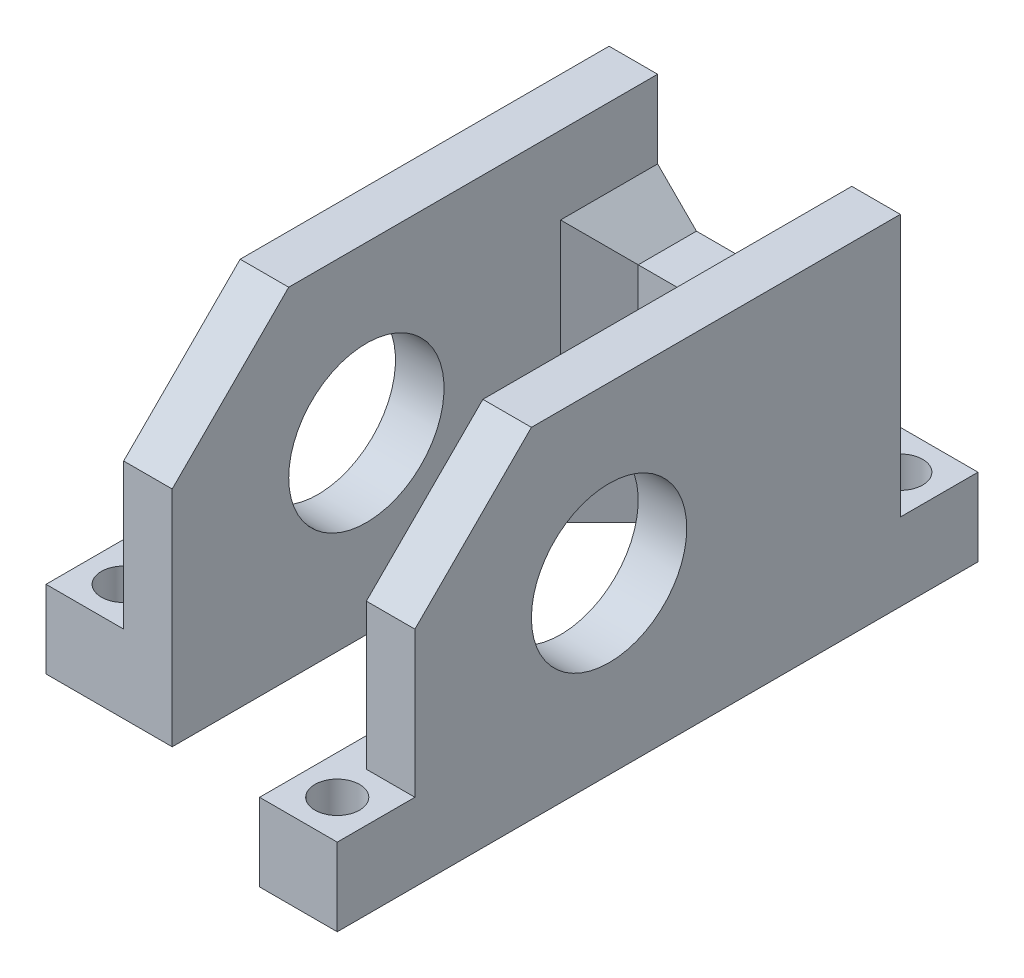
ISO-10303-21;
HEADER;
FILE_DESCRIPTION(('STEP AP214'),'2;1');
FILE_NAME('part.step','',(''),(''),'','','');
FILE_SCHEMA(('AUTOMOTIVE_DESIGN { 1 0 10303 214 1 1 1 1 }'));
ENDSEC;
DATA;
#1=APPLICATION_CONTEXT('core data for automotive mechanical design processes');
#2=APPLICATION_PROTOCOL_DEFINITION('international standard','automotive_design',2000,#1);
#3=PRODUCT_CONTEXT('',#1,'mechanical');
#4=PRODUCT('Part','Part','',(#3));
#5=PRODUCT_RELATED_PRODUCT_CATEGORY('part','',(#4));
#6=PRODUCT_DEFINITION_FORMATION('','',#4);
#7=PRODUCT_DEFINITION_CONTEXT('part definition',#1,'design');
#8=PRODUCT_DEFINITION('design','',#6,#7);
#9=PRODUCT_DEFINITION_SHAPE('','',#8);
#10=(LENGTH_UNIT() NAMED_UNIT(*) SI_UNIT(.MILLI.,.METRE.));
#11=(NAMED_UNIT(*) PLANE_ANGLE_UNIT() SI_UNIT($,.RADIAN.));
#12=(NAMED_UNIT(*) SI_UNIT($,.STERADIAN.) SOLID_ANGLE_UNIT());
#13=UNCERTAINTY_MEASURE_WITH_UNIT(LENGTH_MEASURE(1.E-05),#10,'distance_accuracy_value','');
#14=(GEOMETRIC_REPRESENTATION_CONTEXT(3) GLOBAL_UNCERTAINTY_ASSIGNED_CONTEXT((#13)) GLOBAL_UNIT_ASSIGNED_CONTEXT((#10,
#11,#12)) REPRESENTATION_CONTEXT('',''));
#15=CARTESIAN_POINT('',(0.,0.,0.));
#16=DIRECTION('',(0.,0.,1.));
#17=DIRECTION('',(1.,0.,0.));
#18=AXIS2_PLACEMENT_3D('',#15,#16,#17);
#19=CARTESIAN_POINT('',(0.,35.,-9.));
#20=DIRECTION('',(0.,0.,-1.));
#21=DIRECTION('',(-1.,0.,0.));
#22=AXIS2_PLACEMENT_3D('',#19,#20,#21);
#23=PLANE('',#22);
#24=DIRECTION('',(-0.707106781186548,-0.707106781186548,0.));
#25=VECTOR('',#24,1.);
#26=CARTESIAN_POINT('',(-12.5,12.5,-9.));
#27=LINE('',#26,#25);
#28=CARTESIAN_POINT('',(2.,27.,-9.));
#29=VERTEX_POINT('',#28);
#30=CARTESIAN_POINT('',(-2.,23.,-9.));
#31=VERTEX_POINT('',#30);
#32=EDGE_CURVE('E521',#29,#31,#27,.T.);
#33=ORIENTED_EDGE('',*,*,#32,.F.);
#34=DIRECTION('',(0.,1.,0.));
#35=VECTOR('',#34,1.);
#36=CARTESIAN_POINT('',(2.,0.,-9.));
#37=LINE('',#36,#35);
#38=CARTESIAN_POINT('',(2.,35.,-9.));
#39=VERTEX_POINT('',#38);
#40=EDGE_CURVE('E518',#29,#39,#37,.T.);
#41=ORIENTED_EDGE('',*,*,#40,.T.);
#42=DIRECTION('',(1.,0.,0.));
#43=VECTOR('',#42,1.);
#44=CARTESIAN_POINT('',(0.,35.,-9.));
#45=LINE('',#44,#43);
#46=CARTESIAN_POINT('',(7.,35.,-9.));
#47=VERTEX_POINT('',#46);
#48=EDGE_CURVE('E255',#39,#47,#45,.T.);
#49=ORIENTED_EDGE('',*,*,#48,.T.);
#50=DIRECTION('',(0.,-1.,0.));
#51=VECTOR('',#50,1.);
#52=CARTESIAN_POINT('',(7.,35.,-9.));
#53=LINE('',#52,#51);
#54=CARTESIAN_POINT('',(7.,8.,-9.));
#55=VERTEX_POINT('',#54);
#56=EDGE_CURVE('E263',#47,#55,#53,.T.);
#57=ORIENTED_EDGE('',*,*,#56,.T.);
#58=DIRECTION('',(1.,0.,0.));
#59=VECTOR('',#58,1.);
#60=CARTESIAN_POINT('',(0.,8.,-9.));
#61=LINE('',#60,#59);
#62=CARTESIAN_POINT('',(-1.00000000000001,8.,-9.));
#63=VERTEX_POINT('',#62);
#64=EDGE_CURVE('E435',#63,#55,#61,.T.);
#65=ORIENTED_EDGE('',*,*,#64,.F.);
#66=DIRECTION('',(0.,-1.,0.));
#67=VECTOR('',#66,1.);
#68=CARTESIAN_POINT('',(-1.00000000000001,8.,-9.));
#69=LINE('',#68,#67);
#70=CARTESIAN_POINT('',(-1.00000000000001,0.,-9.));
#71=VERTEX_POINT('',#70);
#72=EDGE_CURVE('E448',#63,#71,#69,.T.);
#73=ORIENTED_EDGE('',*,*,#72,.T.);
#74=DIRECTION('',(1.,0.,0.));
#75=VECTOR('',#74,1.);
#76=CARTESIAN_POINT('',(0.,0.,-9.));
#77=LINE('',#76,#75);
#78=CARTESIAN_POINT('',(-31.,0.,-8.99999999999999));
#79=VERTEX_POINT('',#78);
#80=EDGE_CURVE('E264',#79,#71,#77,.T.);
#81=ORIENTED_EDGE('',*,*,#80,.F.);
#82=DIRECTION('',(0.,-1.,0.));
#83=VECTOR('',#82,1.);
#84=CARTESIAN_POINT('',(-31.,8.,-8.99999999999999));
#85=LINE('',#84,#83);
#86=CARTESIAN_POINT('',(-31.,8.,-8.99999999999999));
#87=VERTEX_POINT('',#86);
#88=EDGE_CURVE('E338',#87,#79,#85,.T.);
#89=ORIENTED_EDGE('',*,*,#88,.F.);
#90=DIRECTION('',(-1.,0.,0.));
#91=VECTOR('',#90,1.);
#92=CARTESIAN_POINT('',(0.,8.,-9.00000000000002));
#93=LINE('',#92,#91);
#94=CARTESIAN_POINT('',(-23.,8.,-9.));
#95=VERTEX_POINT('',#94);
#96=EDGE_CURVE('E336',#95,#87,#93,.T.);
#97=ORIENTED_EDGE('',*,*,#96,.F.);
#98=DIRECTION('',(0.,-1.,0.));
#99=VECTOR('',#98,1.);
#100=CARTESIAN_POINT('',(-23.,35.,-9.));
#101=LINE('',#100,#99);
#102=CARTESIAN_POINT('',(-23.,35.,-9.));
#103=VERTEX_POINT('',#102);
#104=EDGE_CURVE('E293',#103,#95,#101,.T.);
#105=ORIENTED_EDGE('',*,*,#104,.F.);
#106=CARTESIAN_POINT('',(-18.,35.,-9.));
#107=VERTEX_POINT('',#106);
#108=EDGE_CURVE('E250',#103,#107,#45,.T.);
#109=ORIENTED_EDGE('',*,*,#108,.T.);
#110=DIRECTION('',(0.,1.,0.));
#111=VECTOR('',#110,1.);
#112=CARTESIAN_POINT('',(-18.,0.,-9.));
#113=LINE('',#112,#111);
#114=CARTESIAN_POINT('',(-18.,27.,-9.));
#115=VERTEX_POINT('',#114);
#116=EDGE_CURVE('E515',#115,#107,#113,.T.);
#117=ORIENTED_EDGE('',*,*,#116,.F.);
#118=DIRECTION('',(0.707106781186548,-0.707106781186548,0.));
#119=VECTOR('',#118,1.);
#120=CARTESIAN_POINT('',(4.5,4.5,-9.));
#121=LINE('',#120,#119);
#122=CARTESIAN_POINT('',(-14.,23.,-9.));
#123=VERTEX_POINT('',#122);
#124=EDGE_CURVE('E512',#115,#123,#121,.T.);
#125=ORIENTED_EDGE('',*,*,#124,.T.);
#126=DIRECTION('',(-1.,0.,0.));
#127=VECTOR('',#126,1.);
#128=CARTESIAN_POINT('',(0.,23.,-9.));
#129=LINE('',#128,#127);
#130=EDGE_CURVE('E524',#31,#123,#129,.T.);
#131=ORIENTED_EDGE('',*,*,#130,.F.);
#132=EDGE_LOOP('',(#33,#41,#49,#57,#65,#73,#81,#89,#97,#105,#109,#117,#125,#131));
#133=FACE_BOUND('',#132,.T.);
#134=ADVANCED_FACE('F50',(#133),#23,.T.);
#135=CARTESIAN_POINT('',(0.,35.,0.));
#136=DIRECTION('',(0.,1.,0.));
#137=DIRECTION('',(0.,0.,1.));
#138=AXIS2_PLACEMENT_3D('',#135,#136,#137);
#139=PLANE('',#138);
#140=DIRECTION('',(-1.,0.,0.));
#141=VECTOR('',#140,1.);
#142=CARTESIAN_POINT('',(27.,35.,29.));
#143=LINE('',#142,#141);
#144=CARTESIAN_POINT('',(7.,35.,29.));
#145=VERTEX_POINT('',#144);
#146=CARTESIAN_POINT('',(2.00000000000001,35.,29.));
#147=VERTEX_POINT('',#146);
#148=EDGE_CURVE('E246',#145,#147,#143,.T.);
#149=ORIENTED_EDGE('',*,*,#148,.F.);
#150=DIRECTION('',(0.,0.,1.));
#151=VECTOR('',#150,1.);
#152=CARTESIAN_POINT('',(7.,35.,0.));
#153=LINE('',#152,#151);
#154=EDGE_CURVE('E260',#47,#145,#153,.T.);
#155=ORIENTED_EDGE('',*,*,#154,.F.);
#156=ORIENTED_EDGE('',*,*,#48,.F.);
#157=DIRECTION('',(0.,0.,-1.));
#158=VECTOR('',#157,1.);
#159=CARTESIAN_POINT('',(2.00000000000001,35.,0.));
#160=LINE('',#159,#158);
#161=EDGE_CURVE('E253',#147,#39,#160,.T.);
#162=ORIENTED_EDGE('',*,*,#161,.F.);
#163=EDGE_LOOP('',(#149,#155,#156,#162));
#164=FACE_BOUND('',#163,.T.);
#165=ADVANCED_FACE('F569',(#164),#139,.T.);
#166=CARTESIAN_POINT('',(-18.,35.,1.));
#167=DIRECTION('',(0.707106781186547,0.,0.707106781186548));
#168=DIRECTION('',(0.707106781186548,0.,-0.707106781186547));
#169=AXIS2_PLACEMENT_3D('',#166,#167,#168);
#170=PLANE('',#169);
#171=DIRECTION('',(0.,-1.,0.));
#172=VECTOR('',#171,1.);
#173=CARTESIAN_POINT('',(-14.,35.,-3.));
#174=LINE('',#173,#172);
#175=CARTESIAN_POINT('',(-14.,23.,-2.99999999999999));
#176=VERTEX_POINT('',#175);
#177=CARTESIAN_POINT('',(-14.,0.,-3.));
#178=VERTEX_POINT('',#177);
#179=EDGE_CURVE('E306',#176,#178,#174,.T.);
#180=ORIENTED_EDGE('',*,*,#179,.F.);
#181=DIRECTION('',(-0.577350269189626,0.577350269189626,0.577350269189625));
#182=VECTOR('',#181,1.);
#183=CARTESIAN_POINT('',(-20.6666666666667,29.6666666666667,3.66666666666667));
#184=LINE('',#183,#182);
#185=CARTESIAN_POINT('',(-18.,27.,1.));
#186=VERTEX_POINT('',#185);
#187=EDGE_CURVE('E298',#176,#186,#184,.T.);
#188=ORIENTED_EDGE('',*,*,#187,.T.);
#189=DIRECTION('',(0.,-1.,0.));
#190=VECTOR('',#189,1.);
#191=CARTESIAN_POINT('',(-18.,35.,1.));
#192=LINE('',#191,#190);
#193=CARTESIAN_POINT('',(-18.,0.,0.999999999999997));
#194=VERTEX_POINT('',#193);
#195=EDGE_CURVE('E318',#186,#194,#192,.T.);
#196=ORIENTED_EDGE('',*,*,#195,.T.);
#197=DIRECTION('',(-0.707106781186548,0.,0.707106781186547));
#198=VECTOR('',#197,1.);
#199=CARTESIAN_POINT('',(-18.,0.,1.));
#200=LINE('',#199,#198);
#201=EDGE_CURVE('E317',#178,#194,#200,.T.);
#202=ORIENTED_EDGE('',*,*,#201,.F.);
#203=EDGE_LOOP('',(#180,#188,#196,#202));
#204=FACE_BOUND('',#203,.T.);
#205=ADVANCED_FACE('F314',(#204),#170,.T.);
#206=CARTESIAN_POINT('',(-23.,35.,0.));
#207=DIRECTION('',(1.,0.,0.));
#208=DIRECTION('',(0.,0.,-1.));
#209=AXIS2_PLACEMENT_3D('',#206,#207,#208);
#210=PLANE('',#209);
#211=CARTESIAN_POINT('',(-23.,18.,21.));
#212=DIRECTION('',(-1.,0.,0.));
#213=DIRECTION('',(0.,0.,1.));
#214=AXIS2_PLACEMENT_3D('',#211,#212,#213);
#215=CIRCLE('',#214,8.);
#216=CARTESIAN_POINT('',(-23.,18.,29.));
#217=VERTEX_POINT('',#216);
#218=EDGE_CURVE('E496',#217,#217,#215,.T.);
#219=ORIENTED_EDGE('',*,*,#218,.F.);
#220=EDGE_LOOP('',(#219));
#221=FACE_BOUND('',#220,.T.);
#222=DIRECTION('',(0.,-1.,0.));
#223=VECTOR('',#222,1.);
#224=CARTESIAN_POINT('',(-23.,35.,41.));
#225=LINE('',#224,#223);
#226=CARTESIAN_POINT('',(-23.,23.,41.));
#227=VERTEX_POINT('',#226);
#228=CARTESIAN_POINT('',(-23.,8.,41.));
#229=VERTEX_POINT('',#228);
#230=EDGE_CURVE('E245',#227,#229,#225,.T.);
#231=ORIENTED_EDGE('',*,*,#230,.F.);
#232=DIRECTION('',(0.,-0.707106781186548,0.707106781186548));
#233=VECTOR('',#232,1.);
#234=CARTESIAN_POINT('',(-23.,32.,32.));
#235=LINE('',#234,#233);
#236=CARTESIAN_POINT('',(-23.,35.,29.));
#237=VERTEX_POINT('',#236);
#238=EDGE_CURVE('E233',#237,#227,#235,.T.);
#239=ORIENTED_EDGE('',*,*,#238,.F.);
#240=DIRECTION('',(0.,0.,1.));
#241=VECTOR('',#240,1.);
#242=CARTESIAN_POINT('',(-23.,35.,0.));
#243=LINE('',#242,#241);
#244=EDGE_CURVE('E242',#103,#237,#243,.T.);
#245=ORIENTED_EDGE('',*,*,#244,.F.);
#246=ORIENTED_EDGE('',*,*,#104,.T.);
#247=DIRECTION('',(0.,0.,1.));
#248=VECTOR('',#247,1.);
#249=CARTESIAN_POINT('',(-23.,8.,0.));
#250=LINE('',#249,#248);
#251=CARTESIAN_POINT('',(-23.,8.,-0.999999999999994));
#252=VERTEX_POINT('',#251);
#253=EDGE_CURVE('E334',#95,#252,#250,.T.);
#254=ORIENTED_EDGE('',*,*,#253,.T.);
#255=DIRECTION('',(0.,-1.,0.));
#256=VECTOR('',#255,1.);
#257=CARTESIAN_POINT('',(-23.,8.,-0.999999999999994));
#258=LINE('',#257,#256);
#259=CARTESIAN_POINT('',(-23.,0.,-0.999999999999994));
#260=VERTEX_POINT('',#259);
#261=EDGE_CURVE('E348',#252,#260,#258,.T.);
#262=ORIENTED_EDGE('',*,*,#261,.T.);
#263=DIRECTION('',(0.,0.,1.));
#264=VECTOR('',#263,1.);
#265=CARTESIAN_POINT('',(-23.,0.,0.));
#266=LINE('',#265,#264);
#267=CARTESIAN_POINT('',(-23.,0.,33.));
#268=VERTEX_POINT('',#267);
#269=EDGE_CURVE('E267',#260,#268,#266,.T.);
#270=ORIENTED_EDGE('',*,*,#269,.T.);
#271=DIRECTION('',(0.,-1.,0.));
#272=VECTOR('',#271,1.);
#273=CARTESIAN_POINT('',(-23.,8.,33.));
#274=LINE('',#273,#272);
#275=CARTESIAN_POINT('',(-23.,8.,33.));
#276=VERTEX_POINT('',#275);
#277=EDGE_CURVE('E369',#276,#268,#274,.T.);
#278=ORIENTED_EDGE('',*,*,#277,.F.);
#279=DIRECTION('',(0.,0.,1.));
#280=VECTOR('',#279,1.);
#281=CARTESIAN_POINT('',(-23.,8.,0.));
#282=LINE('',#281,#280);
#283=EDGE_CURVE('E367',#276,#229,#282,.T.);
#284=ORIENTED_EDGE('',*,*,#283,.T.);
#285=EDGE_LOOP('',(#231,#239,#245,#246,#254,#262,#270,#278,#284));
#286=FACE_BOUND('',#285,.T.);
#287=ADVANCED_FACE('F241',(#221,#286),#210,.F.);
#288=CARTESIAN_POINT('',(0.,35.,41.));
#289=DIRECTION('',(0.,0.,-1.));
#290=DIRECTION('',(-1.,0.,0.));
#291=AXIS2_PLACEMENT_3D('',#288,#289,#290);
#292=PLANE('',#291);
#293=DIRECTION('',(0.,-1.,0.));
#294=VECTOR('',#293,1.);
#295=CARTESIAN_POINT('',(-18.,35.,41.));
#296=LINE('',#295,#294);
#297=CARTESIAN_POINT('',(-18.,23.,41.));
#298=VERTEX_POINT('',#297);
#299=CARTESIAN_POINT('',(-18.,0.,41.));
#300=VERTEX_POINT('',#299);
#301=EDGE_CURVE('E290',#298,#300,#296,.T.);
#302=ORIENTED_EDGE('',*,*,#301,.F.);
#303=DIRECTION('',(-1.,0.,0.));
#304=VECTOR('',#303,1.);
#305=CARTESIAN_POINT('',(27.,23.,41.));
#306=LINE('',#305,#304);
#307=EDGE_CURVE('E494',#298,#227,#306,.T.);
#308=ORIENTED_EDGE('',*,*,#307,.T.);
#309=ORIENTED_EDGE('',*,*,#230,.T.);
#310=DIRECTION('',(-1.,0.,0.));
#311=VECTOR('',#310,1.);
#312=CARTESIAN_POINT('',(0.,8.,41.));
#313=LINE('',#312,#311);
#314=CARTESIAN_POINT('',(-31.,8.,41.));
#315=VERTEX_POINT('',#314);
#316=EDGE_CURVE('E364',#229,#315,#313,.T.);
#317=ORIENTED_EDGE('',*,*,#316,.T.);
#318=DIRECTION('',(0.,-1.,0.));
#319=VECTOR('',#318,1.);
#320=CARTESIAN_POINT('',(-31.,8.,41.));
#321=LINE('',#320,#319);
#322=CARTESIAN_POINT('',(-31.,0.,41.));
#323=VERTEX_POINT('',#322);
#324=EDGE_CURVE('E379',#315,#323,#321,.T.);
#325=ORIENTED_EDGE('',*,*,#324,.T.);
#326=DIRECTION('',(1.,0.,0.));
#327=VECTOR('',#326,1.);
#328=CARTESIAN_POINT('',(0.,0.,41.));
#329=LINE('',#328,#327);
#330=EDGE_CURVE('E270',#323,#300,#329,.T.);
#331=ORIENTED_EDGE('',*,*,#330,.T.);
#332=EDGE_LOOP('',(#302,#308,#309,#317,#325,#331));
#333=FACE_BOUND('',#332,.T.);
#334=ADVANCED_FACE('F493',(#333),#292,.F.);
#335=CARTESIAN_POINT('',(-18.,35.,0.));
#336=DIRECTION('',(-1.,0.,0.));
#337=DIRECTION('',(0.,0.,1.));
#338=AXIS2_PLACEMENT_3D('',#335,#336,#337);
#339=PLANE('',#338);
#340=CARTESIAN_POINT('',(-18.,18.,21.));
#341=DIRECTION('',(-1.,0.,0.));
#342=DIRECTION('',(0.,0.,1.));
#343=AXIS2_PLACEMENT_3D('',#340,#341,#342);
#344=CIRCLE('',#343,8.);
#345=CARTESIAN_POINT('',(-18.,18.,29.));
#346=VERTEX_POINT('',#345);
#347=EDGE_CURVE('E509',#346,#346,#344,.T.);
#348=ORIENTED_EDGE('',*,*,#347,.T.);
#349=EDGE_LOOP('',(#348));
#350=FACE_BOUND('',#349,.T.);
#351=DIRECTION('',(0.,0.,-1.));
#352=VECTOR('',#351,1.);
#353=CARTESIAN_POINT('',(-18.,35.,0.));
#354=LINE('',#353,#352);
#355=CARTESIAN_POINT('',(-18.,35.,29.));
#356=VERTEX_POINT('',#355);
#357=EDGE_CURVE('E251',#356,#107,#354,.T.);
#358=ORIENTED_EDGE('',*,*,#357,.F.);
#359=DIRECTION('',(0.,-0.707106781186548,0.707106781186548));
#360=VECTOR('',#359,1.);
#361=CARTESIAN_POINT('',(-18.,49.5,14.5));
#362=LINE('',#361,#360);
#363=EDGE_CURVE('E72',#356,#298,#362,.T.);
#364=ORIENTED_EDGE('',*,*,#363,.T.);
#365=ORIENTED_EDGE('',*,*,#301,.T.);
#366=DIRECTION('',(0.,0.,-1.));
#367=VECTOR('',#366,1.);
#368=CARTESIAN_POINT('',(-18.,0.,0.));
#369=LINE('',#368,#367);
#370=EDGE_CURVE('E273',#300,#194,#369,.T.);
#371=ORIENTED_EDGE('',*,*,#370,.T.);
#372=ORIENTED_EDGE('',*,*,#195,.F.);
#373=DIRECTION('',(0.,0.,-1.));
#374=VECTOR('',#373,1.);
#375=CARTESIAN_POINT('',(-18.,27.,26.));
#376=LINE('',#375,#374);
#377=EDGE_CURVE('E527',#186,#115,#376,.T.);
#378=ORIENTED_EDGE('',*,*,#377,.T.);
#379=ORIENTED_EDGE('',*,*,#116,.T.);
#380=EDGE_LOOP('',(#358,#364,#365,#371,#372,#378,#379));
#381=FACE_BOUND('',#380,.T.);
#382=ADVANCED_FACE('F555',(#350,#381),#339,.F.);
#383=CARTESIAN_POINT('',(0.,35.,-3.));
#384=DIRECTION('',(0.,0.,-1.));
#385=DIRECTION('',(-1.,0.,0.));
#386=AXIS2_PLACEMENT_3D('',#383,#384,#385);
#387=PLANE('',#386);
#388=DIRECTION('',(0.,-1.,0.));
#389=VECTOR('',#388,1.);
#390=CARTESIAN_POINT('',(-1.99999999999999,35.,-3.));
#391=LINE('',#390,#389);
#392=CARTESIAN_POINT('',(-2.,23.,-3.00000000000001));
#393=VERTEX_POINT('',#392);
#394=CARTESIAN_POINT('',(-1.99999999999999,0.,-3.));
#395=VERTEX_POINT('',#394);
#396=EDGE_CURVE('E308',#393,#395,#391,.T.);
#397=ORIENTED_EDGE('',*,*,#396,.F.);
#398=DIRECTION('',(-1.,0.,0.));
#399=VECTOR('',#398,1.);
#400=CARTESIAN_POINT('',(0.,23.,-3.));
#401=LINE('',#400,#399);
#402=EDGE_CURVE('E58',#393,#176,#401,.T.);
#403=ORIENTED_EDGE('',*,*,#402,.T.);
#404=ORIENTED_EDGE('',*,*,#179,.T.);
#405=DIRECTION('',(1.,0.,0.));
#406=VECTOR('',#405,1.);
#407=CARTESIAN_POINT('',(0.,0.,-3.));
#408=LINE('',#407,#406);
#409=EDGE_CURVE('E276',#178,#395,#408,.T.);
#410=ORIENTED_EDGE('',*,*,#409,.T.);
#411=EDGE_LOOP('',(#397,#403,#404,#410));
#412=FACE_BOUND('',#411,.T.);
#413=ADVANCED_FACE('F305',(#412),#387,.F.);
#414=CARTESIAN_POINT('',(2.00000000000001,35.,0.));
#415=DIRECTION('',(-1.,0.,0.));
#416=DIRECTION('',(0.,0.,1.));
#417=AXIS2_PLACEMENT_3D('',#414,#415,#416);
#418=PLANE('',#417);
#419=DIRECTION('',(0.,-0.707106781186548,0.707106781186548));
#420=VECTOR('',#419,1.);
#421=CARTESIAN_POINT('',(2.00000000000001,49.5,14.5));
#422=LINE('',#421,#420);
#423=CARTESIAN_POINT('',(2.00000000000001,23.,41.));
#424=VERTEX_POINT('',#423);
#425=EDGE_CURVE('E503',#147,#424,#422,.T.);
#426=ORIENTED_EDGE('',*,*,#425,.F.);
#427=ORIENTED_EDGE('',*,*,#161,.T.);
#428=ORIENTED_EDGE('',*,*,#40,.F.);
#429=DIRECTION('',(0.,0.,-1.));
#430=VECTOR('',#429,1.);
#431=CARTESIAN_POINT('',(2.,27.,26.));
#432=LINE('',#431,#430);
#433=CARTESIAN_POINT('',(2.00000000000001,27.,1.00000000000001));
#434=VERTEX_POINT('',#433);
#435=EDGE_CURVE('E533',#434,#29,#432,.T.);
#436=ORIENTED_EDGE('',*,*,#435,.F.);
#437=DIRECTION('',(0.,-1.,0.));
#438=VECTOR('',#437,1.);
#439=CARTESIAN_POINT('',(2.00000000000001,35.,1.00000000000001));
#440=LINE('',#439,#438);
#441=CARTESIAN_POINT('',(2.00000000000001,0.,1.00000000000001));
#442=VERTEX_POINT('',#441);
#443=EDGE_CURVE('E538',#434,#442,#440,.T.);
#444=ORIENTED_EDGE('',*,*,#443,.T.);
#445=DIRECTION('',(0.,0.,-1.));
#446=VECTOR('',#445,1.);
#447=CARTESIAN_POINT('',(2.00000000000001,0.,0.));
#448=LINE('',#447,#446);
#449=CARTESIAN_POINT('',(2.00000000000001,0.,37.));
#450=VERTEX_POINT('',#449);
#451=EDGE_CURVE('E279',#450,#442,#448,.T.);
#452=ORIENTED_EDGE('',*,*,#451,.F.);
#453=DIRECTION('',(0.,-1.,0.));
#454=VECTOR('',#453,1.);
#455=CARTESIAN_POINT('',(2.00000000000001,8.,37.));
#456=LINE('',#455,#454);
#457=CARTESIAN_POINT('',(2.00000000000001,8.,37.));
#458=VERTEX_POINT('',#457);
#459=EDGE_CURVE('E406',#458,#450,#456,.T.);
#460=ORIENTED_EDGE('',*,*,#459,.F.);
#461=DIRECTION('',(0.,0.,-1.));
#462=VECTOR('',#461,1.);
#463=CARTESIAN_POINT('',(2.00000000000001,8.,0.));
#464=LINE('',#463,#462);
#465=CARTESIAN_POINT('',(2.00000000000001,8.,41.));
#466=VERTEX_POINT('',#465);
#467=EDGE_CURVE('E404',#466,#458,#464,.T.);
#468=ORIENTED_EDGE('',*,*,#467,.F.);
#469=DIRECTION('',(0.,-1.,0.));
#470=VECTOR('',#469,1.);
#471=CARTESIAN_POINT('',(2.00000000000001,35.,41.));
#472=LINE('',#471,#470);
#473=EDGE_CURVE('E288',#424,#466,#472,.T.);
#474=ORIENTED_EDGE('',*,*,#473,.F.);
#475=EDGE_LOOP('',(#426,#427,#428,#436,#444,#452,#460,#468,#474));
#476=FACE_BOUND('',#475,.T.);
#477=CARTESIAN_POINT('',(2.00000000000001,18.,21.));
#478=DIRECTION('',(-1.,0.,0.));
#479=DIRECTION('',(0.,0.,1.));
#480=AXIS2_PLACEMENT_3D('',#477,#478,#479);
#481=CIRCLE('',#480,8.);
#482=CARTESIAN_POINT('',(2.00000000000001,18.,29.));
#483=VERTEX_POINT('',#482);
#484=EDGE_CURVE('E506',#483,#483,#481,.T.);
#485=ORIENTED_EDGE('',*,*,#484,.F.);
#486=EDGE_LOOP('',(#485));
#487=FACE_BOUND('',#486,.T.);
#488=ADVANCED_FACE('F544',(#476,#487),#418,.T.);
#489=CARTESIAN_POINT('',(0.,35.,41.));
#490=DIRECTION('',(0.,0.,1.));
#491=DIRECTION('',(1.,0.,0.));
#492=AXIS2_PLACEMENT_3D('',#489,#490,#491);
#493=PLANE('',#492);
#494=CARTESIAN_POINT('',(7.,23.,41.));
#495=VERTEX_POINT('',#494);
#496=EDGE_CURVE('E65',#495,#424,#306,.T.);
#497=ORIENTED_EDGE('',*,*,#496,.T.);
#498=ORIENTED_EDGE('',*,*,#473,.T.);
#499=DIRECTION('',(-1.,0.,0.));
#500=VECTOR('',#499,1.);
#501=CARTESIAN_POINT('',(0.,8.,41.));
#502=LINE('',#501,#500);
#503=CARTESIAN_POINT('',(7.,8.,41.));
#504=VERTEX_POINT('',#503);
#505=EDGE_CURVE('E401',#504,#466,#502,.T.);
#506=ORIENTED_EDGE('',*,*,#505,.F.);
#507=DIRECTION('',(0.,-1.,0.));
#508=VECTOR('',#507,1.);
#509=CARTESIAN_POINT('',(7.,35.,41.));
#510=LINE('',#509,#508);
#511=EDGE_CURVE('E286',#495,#504,#510,.T.);
#512=ORIENTED_EDGE('',*,*,#511,.F.);
#513=EDGE_LOOP('',(#497,#498,#506,#512));
#514=FACE_BOUND('',#513,.T.);
#515=ADVANCED_FACE('F595',(#514),#493,.T.);
#516=CARTESIAN_POINT('',(7.,35.,0.));
#517=DIRECTION('',(1.,0.,0.));
#518=DIRECTION('',(0.,0.,-1.));
#519=AXIS2_PLACEMENT_3D('',#516,#517,#518);
#520=PLANE('',#519);
#521=DIRECTION('',(0.,0.707106781186548,-0.707106781186548));
#522=VECTOR('',#521,1.);
#523=CARTESIAN_POINT('',(7.,49.5,14.5));
#524=LINE('',#523,#522);
#525=EDGE_CURVE('E501',#495,#145,#524,.T.);
#526=ORIENTED_EDGE('',*,*,#525,.F.);
#527=ORIENTED_EDGE('',*,*,#511,.T.);
#528=DIRECTION('',(0.,0.,1.));
#529=VECTOR('',#528,1.);
#530=CARTESIAN_POINT('',(7.,8.,0.));
#531=LINE('',#530,#529);
#532=CARTESIAN_POINT('',(7.,8.,49.));
#533=VERTEX_POINT('',#532);
#534=EDGE_CURVE('E398',#504,#533,#531,.T.);
#535=ORIENTED_EDGE('',*,*,#534,.T.);
#536=DIRECTION('',(0.,-1.,0.));
#537=VECTOR('',#536,1.);
#538=CARTESIAN_POINT('',(7.,8.,49.));
#539=LINE('',#538,#537);
#540=CARTESIAN_POINT('',(7.,0.,49.));
#541=VERTEX_POINT('',#540);
#542=EDGE_CURVE('E418',#533,#541,#539,.T.);
#543=ORIENTED_EDGE('',*,*,#542,.T.);
#544=DIRECTION('',(0.,0.,1.));
#545=VECTOR('',#544,1.);
#546=CARTESIAN_POINT('',(7.,0.,0.));
#547=LINE('',#546,#545);
#548=CARTESIAN_POINT('',(7.,0.,-17.));
#549=VERTEX_POINT('',#548);
#550=EDGE_CURVE('E282',#549,#541,#547,.T.);
#551=ORIENTED_EDGE('',*,*,#550,.F.);
#552=DIRECTION('',(0.,-1.,0.));
#553=VECTOR('',#552,1.);
#554=CARTESIAN_POINT('',(7.,8.,-17.));
#555=LINE('',#554,#553);
#556=CARTESIAN_POINT('',(7.,8.,-17.));
#557=VERTEX_POINT('',#556);
#558=EDGE_CURVE('E439',#557,#549,#555,.T.);
#559=ORIENTED_EDGE('',*,*,#558,.F.);
#560=DIRECTION('',(0.,0.,-1.));
#561=VECTOR('',#560,1.);
#562=CARTESIAN_POINT('',(7.,8.,0.));
#563=LINE('',#562,#561);
#564=EDGE_CURVE('E437',#55,#557,#563,.T.);
#565=ORIENTED_EDGE('',*,*,#564,.F.);
#566=ORIENTED_EDGE('',*,*,#56,.F.);
#567=ORIENTED_EDGE('',*,*,#154,.T.);
#568=EDGE_LOOP('',(#526,#527,#535,#543,#551,#559,#565,#566,#567));
#569=FACE_BOUND('',#568,.T.);
#570=CARTESIAN_POINT('',(7.,18.,21.));
#571=DIRECTION('',(1.,0.,0.));
#572=DIRECTION('',(0.,0.,-1.));
#573=AXIS2_PLACEMENT_3D('',#570,#571,#572);
#574=CIRCLE('',#573,8.);
#575=CARTESIAN_POINT('',(7.,18.,13.));
#576=VERTEX_POINT('',#575);
#577=EDGE_CURVE('E53',#576,#576,#574,.T.);
#578=ORIENTED_EDGE('',*,*,#577,.F.);
#579=EDGE_LOOP('',(#578));
#580=FACE_BOUND('',#579,.T.);
#581=ADVANCED_FACE('F571',(#569,#580),#520,.T.);
#582=DIRECTION('',(-1.,0.,0.));
#583=VECTOR('',#582,1.);
#584=CARTESIAN_POINT('',(0.,35.,29.));
#585=LINE('',#584,#583);
#586=EDGE_CURVE('E13',#356,#237,#585,.T.);
#587=ORIENTED_EDGE('',*,*,#586,.F.);
#588=ORIENTED_EDGE('',*,*,#357,.T.);
#589=ORIENTED_EDGE('',*,*,#108,.F.);
#590=ORIENTED_EDGE('',*,*,#244,.T.);
#591=EDGE_LOOP('',(#587,#588,#589,#590));
#592=FACE_BOUND('',#591,.T.);
#593=ADVANCED_FACE('F248',(#592),#139,.T.);
#594=CARTESIAN_POINT('',(0.,0.,0.));
#595=DIRECTION('',(0.,1.,0.));
#596=DIRECTION('',(0.,0.,1.));
#597=AXIS2_PLACEMENT_3D('',#594,#595,#596);
#598=PLANE('',#597);
#599=ORIENTED_EDGE('',*,*,#451,.T.);
#600=DIRECTION('',(-0.707106781186547,0.,-0.707106781186548));
#601=VECTOR('',#600,1.);
#602=CARTESIAN_POINT('',(-1.99999999999999,0.,-3.));
#603=LINE('',#602,#601);
#604=EDGE_CURVE('E530',#442,#395,#603,.T.);
#605=ORIENTED_EDGE('',*,*,#604,.T.);
#606=ORIENTED_EDGE('',*,*,#409,.F.);
#607=ORIENTED_EDGE('',*,*,#201,.T.);
#608=ORIENTED_EDGE('',*,*,#370,.F.);
#609=ORIENTED_EDGE('',*,*,#330,.F.);
#610=DIRECTION('',(0.,0.,-1.));
#611=VECTOR('',#610,1.);
#612=CARTESIAN_POINT('',(-31.,0.,0.));
#613=LINE('',#612,#611);
#614=CARTESIAN_POINT('',(-31.,0.,33.));
#615=VERTEX_POINT('',#614);
#616=EDGE_CURVE('E359',#323,#615,#613,.T.);
#617=ORIENTED_EDGE('',*,*,#616,.T.);
#618=DIRECTION('',(1.,0.,0.));
#619=VECTOR('',#618,1.);
#620=CARTESIAN_POINT('',(0.,0.,33.));
#621=LINE('',#620,#619);
#622=EDGE_CURVE('E372',#615,#268,#621,.T.);
#623=ORIENTED_EDGE('',*,*,#622,.T.);
#624=ORIENTED_EDGE('',*,*,#269,.F.);
#625=DIRECTION('',(1.,0.,0.));
#626=VECTOR('',#625,1.);
#627=CARTESIAN_POINT('',(0.,0.,-0.999999999999994));
#628=LINE('',#627,#626);
#629=CARTESIAN_POINT('',(-31.,0.,-0.999999999999994));
#630=VERTEX_POINT('',#629);
#631=EDGE_CURVE('E328',#630,#260,#628,.T.);
#632=ORIENTED_EDGE('',*,*,#631,.F.);
#633=DIRECTION('',(0.,0.,1.));
#634=VECTOR('',#633,1.);
#635=CARTESIAN_POINT('',(-31.,0.,0.));
#636=LINE('',#635,#634);
#637=EDGE_CURVE('E341',#79,#630,#636,.T.);
#638=ORIENTED_EDGE('',*,*,#637,.F.);
#639=ORIENTED_EDGE('',*,*,#80,.T.);
#640=DIRECTION('',(0.,0.,1.));
#641=VECTOR('',#640,1.);
#642=CARTESIAN_POINT('',(-1.00000000000001,0.,0.));
#643=LINE('',#642,#641);
#644=CARTESIAN_POINT('',(-1.00000000000001,0.,-17.));
#645=VERTEX_POINT('',#644);
#646=EDGE_CURVE('E430',#645,#71,#643,.T.);
#647=ORIENTED_EDGE('',*,*,#646,.F.);
#648=DIRECTION('',(-1.,0.,0.));
#649=VECTOR('',#648,1.);
#650=CARTESIAN_POINT('',(0.,0.,-17.));
#651=LINE('',#650,#649);
#652=EDGE_CURVE('E442',#549,#645,#651,.T.);
#653=ORIENTED_EDGE('',*,*,#652,.F.);
#654=ORIENTED_EDGE('',*,*,#550,.T.);
#655=DIRECTION('',(-1.,0.,0.));
#656=VECTOR('',#655,1.);
#657=CARTESIAN_POINT('',(0.,0.,49.));
#658=LINE('',#657,#656);
#659=CARTESIAN_POINT('',(-1.00000000000001,0.,49.));
#660=VERTEX_POINT('',#659);
#661=EDGE_CURVE('E389',#541,#660,#658,.T.);
#662=ORIENTED_EDGE('',*,*,#661,.T.);
#663=DIRECTION('',(0.,0.,-1.));
#664=VECTOR('',#663,1.);
#665=CARTESIAN_POINT('',(-1.00000000000001,0.,0.));
#666=LINE('',#665,#664);
#667=CARTESIAN_POINT('',(-1.00000000000001,0.,37.));
#668=VERTEX_POINT('',#667);
#669=EDGE_CURVE('E411',#660,#668,#666,.T.);
#670=ORIENTED_EDGE('',*,*,#669,.T.);
#671=DIRECTION('',(1.,0.,0.));
#672=VECTOR('',#671,1.);
#673=CARTESIAN_POINT('',(0.,0.,37.));
#674=LINE('',#673,#672);
#675=EDGE_CURVE('E409',#668,#450,#674,.T.);
#676=ORIENTED_EDGE('',*,*,#675,.T.);
#677=EDGE_LOOP('',(#599,#605,#606,#607,#608,#609,#617,#623,#624,#632,#638,#639,#647,#653,#654,
#662,#670,#676));
#678=FACE_BOUND('',#677,.T.);
#679=CARTESIAN_POINT('',(3.,0.,-13.));
#680=DIRECTION('',(0.,1.,0.));
#681=DIRECTION('',(0.,0.,1.));
#682=AXIS2_PLACEMENT_3D('',#679,#680,#681);
#683=CIRCLE('',#682,2.3);
#684=CARTESIAN_POINT('',(3.,0.,-10.7));
#685=VERTEX_POINT('',#684);
#686=EDGE_CURVE('E425',#685,#685,#683,.T.);
#687=ORIENTED_EDGE('',*,*,#686,.T.);
#688=EDGE_LOOP('',(#687));
#689=FACE_BOUND('',#688,.T.);
#690=CARTESIAN_POINT('',(3.,0.,45.));
#691=DIRECTION('',(0.,1.,0.));
#692=DIRECTION('',(0.,0.,1.));
#693=AXIS2_PLACEMENT_3D('',#690,#691,#692);
#694=CIRCLE('',#693,2.3);
#695=CARTESIAN_POINT('',(3.,0.,47.3));
#696=VERTEX_POINT('',#695);
#697=EDGE_CURVE('E384',#696,#696,#694,.T.);
#698=ORIENTED_EDGE('',*,*,#697,.T.);
#699=EDGE_LOOP('',(#698));
#700=FACE_BOUND('',#699,.T.);
#701=CARTESIAN_POINT('',(-27.,0.,37.));
#702=DIRECTION('',(0.,1.,0.));
#703=DIRECTION('',(0.,0.,1.));
#704=AXIS2_PLACEMENT_3D('',#701,#702,#703);
#705=CIRCLE('',#704,2.3);
#706=CARTESIAN_POINT('',(-27.,0.,39.3));
#707=VERTEX_POINT('',#706);
#708=EDGE_CURVE('E354',#707,#707,#705,.T.);
#709=ORIENTED_EDGE('',*,*,#708,.T.);
#710=EDGE_LOOP('',(#709));
#711=FACE_BOUND('',#710,.T.);
#712=CARTESIAN_POINT('',(-27.,0.,-4.99999999999999));
#713=DIRECTION('',(0.,1.,0.));
#714=DIRECTION('',(0.,0.,1.));
#715=AXIS2_PLACEMENT_3D('',#712,#713,#714);
#716=CIRCLE('',#715,2.3);
#717=CARTESIAN_POINT('',(-27.,0.,-2.69999999999999));
#718=VERTEX_POINT('',#717);
#719=EDGE_CURVE('E320',#718,#718,#716,.T.);
#720=ORIENTED_EDGE('',*,*,#719,.T.);
#721=EDGE_LOOP('',(#720));
#722=FACE_BOUND('',#721,.T.);
#723=ADVANCED_FACE('F461',(#678,#689,#700,#711,#722),#598,.F.);
#724=CARTESIAN_POINT('',(0.,8.,-17.));
#725=DIRECTION('',(0.,0.,1.));
#726=DIRECTION('',(1.,0.,0.));
#727=AXIS2_PLACEMENT_3D('',#724,#725,#726);
#728=PLANE('',#727);
#729=ORIENTED_EDGE('',*,*,#652,.T.);
#730=DIRECTION('',(0.,-1.,0.));
#731=VECTOR('',#730,1.);
#732=CARTESIAN_POINT('',(-1.00000000000001,8.,-17.));
#733=LINE('',#732,#731);
#734=CARTESIAN_POINT('',(-1.00000000000001,8.,-17.));
#735=VERTEX_POINT('',#734);
#736=EDGE_CURVE('E268',#735,#645,#733,.T.);
#737=ORIENTED_EDGE('',*,*,#736,.F.);
#738=DIRECTION('',(-1.,0.,0.));
#739=VECTOR('',#738,1.);
#740=CARTESIAN_POINT('',(0.,8.,-17.));
#741=LINE('',#740,#739);
#742=EDGE_CURVE('E429',#557,#735,#741,.T.);
#743=ORIENTED_EDGE('',*,*,#742,.F.);
#744=ORIENTED_EDGE('',*,*,#558,.T.);
#745=EDGE_LOOP('',(#729,#737,#743,#744));
#746=FACE_BOUND('',#745,.T.);
#747=ADVANCED_FACE('F458',(#746),#728,.F.);
#748=CARTESIAN_POINT('',(-1.00000000000001,8.,0.));
#749=DIRECTION('',(1.,0.,0.));
#750=DIRECTION('',(0.,0.,-1.));
#751=AXIS2_PLACEMENT_3D('',#748,#749,#750);
#752=PLANE('',#751);
#753=ORIENTED_EDGE('',*,*,#646,.T.);
#754=ORIENTED_EDGE('',*,*,#72,.F.);
#755=DIRECTION('',(0.,0.,1.));
#756=VECTOR('',#755,1.);
#757=CARTESIAN_POINT('',(-1.00000000000001,8.,0.));
#758=LINE('',#757,#756);
#759=EDGE_CURVE('E433',#735,#63,#758,.T.);
#760=ORIENTED_EDGE('',*,*,#759,.F.);
#761=ORIENTED_EDGE('',*,*,#736,.T.);
#762=EDGE_LOOP('',(#753,#754,#760,#761));
#763=FACE_BOUND('',#762,.T.);
#764=ADVANCED_FACE('F453',(#763),#752,.F.);
#765=CARTESIAN_POINT('',(3.,8.,-13.));
#766=DIRECTION('',(0.,-1.,0.));
#767=DIRECTION('',(0.,0.,-1.));
#768=AXIS2_PLACEMENT_3D('',#765,#766,#767);
#769=CYLINDRICAL_SURFACE('',#768,2.3);
#770=CARTESIAN_POINT('',(3.,8.,-13.));
#771=DIRECTION('',(0.,1.,0.));
#772=DIRECTION('',(0.,0.,1.));
#773=AXIS2_PLACEMENT_3D('',#770,#771,#772);
#774=CIRCLE('',#773,2.3);
#775=CARTESIAN_POINT('',(3.,8.,-10.7));
#776=VERTEX_POINT('',#775);
#777=EDGE_CURVE('E426',#776,#776,#774,.T.);
#778=ORIENTED_EDGE('',*,*,#777,.T.);
#779=EDGE_LOOP('',(#778));
#780=FACE_BOUND('',#779,.T.);
#781=ORIENTED_EDGE('',*,*,#686,.F.);
#782=EDGE_LOOP('',(#781));
#783=FACE_BOUND('',#782,.T.);
#784=ADVANCED_FACE('F626',(#780,#783),#769,.F.);
#785=CARTESIAN_POINT('',(0.,8.,0.));
#786=DIRECTION('',(0.,1.,0.));
#787=DIRECTION('',(0.,0.,1.));
#788=AXIS2_PLACEMENT_3D('',#785,#786,#787);
#789=PLANE('',#788);
#790=ORIENTED_EDGE('',*,*,#777,.F.);
#791=EDGE_LOOP('',(#790));
#792=FACE_BOUND('',#791,.T.);
#793=ORIENTED_EDGE('',*,*,#742,.T.);
#794=ORIENTED_EDGE('',*,*,#759,.T.);
#795=ORIENTED_EDGE('',*,*,#64,.T.);
#796=ORIENTED_EDGE('',*,*,#564,.T.);
#797=EDGE_LOOP('',(#793,#794,#795,#796));
#798=FACE_BOUND('',#797,.T.);
#799=ADVANCED_FACE('F576',(#792,#798),#789,.T.);
#800=CARTESIAN_POINT('',(0.,8.,37.));
#801=DIRECTION('',(0.,0.,-1.));
#802=DIRECTION('',(-1.,0.,0.));
#803=AXIS2_PLACEMENT_3D('',#800,#801,#802);
#804=PLANE('',#803);
#805=ORIENTED_EDGE('',*,*,#675,.F.);
#806=DIRECTION('',(0.,-1.,0.));
#807=VECTOR('',#806,1.);
#808=CARTESIAN_POINT('',(-1.00000000000001,8.,37.));
#809=LINE('',#808,#807);
#810=CARTESIAN_POINT('',(-1.00000000000001,8.,37.));
#811=VERTEX_POINT('',#810);
#812=EDGE_CURVE('E423',#811,#668,#809,.T.);
#813=ORIENTED_EDGE('',*,*,#812,.F.);
#814=DIRECTION('',(1.,0.,0.));
#815=VECTOR('',#814,1.);
#816=CARTESIAN_POINT('',(0.,8.,37.));
#817=LINE('',#816,#815);
#818=EDGE_CURVE('E388',#811,#458,#817,.T.);
#819=ORIENTED_EDGE('',*,*,#818,.T.);
#820=ORIENTED_EDGE('',*,*,#459,.T.);
#821=EDGE_LOOP('',(#805,#813,#819,#820));
#822=FACE_BOUND('',#821,.T.);
#823=ADVANCED_FACE('F588',(#822),#804,.T.);
#824=CARTESIAN_POINT('',(-1.00000000000001,8.,0.));
#825=DIRECTION('',(-1.,0.,0.));
#826=DIRECTION('',(0.,0.,1.));
#827=AXIS2_PLACEMENT_3D('',#824,#825,#826);
#828=PLANE('',#827);
#829=ORIENTED_EDGE('',*,*,#669,.F.);
#830=DIRECTION('',(0.,-1.,0.));
#831=VECTOR('',#830,1.);
#832=CARTESIAN_POINT('',(-1.00000000000001,8.,49.));
#833=LINE('',#832,#831);
#834=CARTESIAN_POINT('',(-1.00000000000001,8.,49.));
#835=VERTEX_POINT('',#834);
#836=EDGE_CURVE('E421',#835,#660,#833,.T.);
#837=ORIENTED_EDGE('',*,*,#836,.F.);
#838=DIRECTION('',(0.,0.,-1.));
#839=VECTOR('',#838,1.);
#840=CARTESIAN_POINT('',(-1.00000000000001,8.,0.));
#841=LINE('',#840,#839);
#842=EDGE_CURVE('E392',#835,#811,#841,.T.);
#843=ORIENTED_EDGE('',*,*,#842,.T.);
#844=ORIENTED_EDGE('',*,*,#812,.T.);
#845=EDGE_LOOP('',(#829,#837,#843,#844));
#846=FACE_BOUND('',#845,.T.);
#847=ADVANCED_FACE('F584',(#846),#828,.T.);
#848=CARTESIAN_POINT('',(0.,8.,49.));
#849=DIRECTION('',(0.,0.,1.));
#850=DIRECTION('',(1.,0.,0.));
#851=AXIS2_PLACEMENT_3D('',#848,#849,#850);
#852=PLANE('',#851);
#853=ORIENTED_EDGE('',*,*,#661,.F.);
#854=ORIENTED_EDGE('',*,*,#542,.F.);
#855=DIRECTION('',(-1.,0.,0.));
#856=VECTOR('',#855,1.);
#857=CARTESIAN_POINT('',(0.,8.,49.));
#858=LINE('',#857,#856);
#859=EDGE_CURVE('E395',#533,#835,#858,.T.);
#860=ORIENTED_EDGE('',*,*,#859,.T.);
#861=ORIENTED_EDGE('',*,*,#836,.T.);
#862=EDGE_LOOP('',(#853,#854,#860,#861));
#863=FACE_BOUND('',#862,.T.);
#864=ADVANCED_FACE('F581',(#863),#852,.T.);
#865=CARTESIAN_POINT('',(3.,8.,45.));
#866=DIRECTION('',(0.,-1.,0.));
#867=DIRECTION('',(0.,0.,-1.));
#868=AXIS2_PLACEMENT_3D('',#865,#866,#867);
#869=CYLINDRICAL_SURFACE('',#868,2.3);
#870=CARTESIAN_POINT('',(3.,8.,45.));
#871=DIRECTION('',(0.,1.,0.));
#872=DIRECTION('',(0.,0.,1.));
#873=AXIS2_PLACEMENT_3D('',#870,#871,#872);
#874=CIRCLE('',#873,2.3);
#875=CARTESIAN_POINT('',(3.,8.,47.3));
#876=VERTEX_POINT('',#875);
#877=EDGE_CURVE('E385',#876,#876,#874,.T.);
#878=ORIENTED_EDGE('',*,*,#877,.T.);
#879=EDGE_LOOP('',(#878));
#880=FACE_BOUND('',#879,.T.);
#881=ORIENTED_EDGE('',*,*,#697,.F.);
#882=EDGE_LOOP('',(#881));
#883=FACE_BOUND('',#882,.T.);
#884=ADVANCED_FACE('F673',(#880,#883),#869,.F.);
#885=CARTESIAN_POINT('',(0.,8.,0.));
#886=DIRECTION('',(0.,1.,0.));
#887=DIRECTION('',(0.,0.,1.));
#888=AXIS2_PLACEMENT_3D('',#885,#886,#887);
#889=PLANE('',#888);
#890=ORIENTED_EDGE('',*,*,#877,.F.);
#891=EDGE_LOOP('',(#890));
#892=FACE_BOUND('',#891,.T.);
#893=ORIENTED_EDGE('',*,*,#818,.F.);
#894=ORIENTED_EDGE('',*,*,#842,.F.);
#895=ORIENTED_EDGE('',*,*,#859,.F.);
#896=ORIENTED_EDGE('',*,*,#534,.F.);
#897=ORIENTED_EDGE('',*,*,#505,.T.);
#898=ORIENTED_EDGE('',*,*,#467,.T.);
#899=EDGE_LOOP('',(#893,#894,#895,#896,#897,#898));
#900=FACE_BOUND('',#899,.T.);
#901=ADVANCED_FACE('F592',(#892,#900),#889,.T.);
#902=CARTESIAN_POINT('',(0.,8.,33.));
#903=DIRECTION('',(0.,0.,-1.));
#904=DIRECTION('',(-1.,0.,0.));
#905=AXIS2_PLACEMENT_3D('',#902,#903,#904);
#906=PLANE('',#905);
#907=ORIENTED_EDGE('',*,*,#622,.F.);
#908=DIRECTION('',(0.,-1.,0.));
#909=VECTOR('',#908,1.);
#910=CARTESIAN_POINT('',(-31.,8.,33.));
#911=LINE('',#910,#909);
#912=CARTESIAN_POINT('',(-31.,8.,33.));
#913=VERTEX_POINT('',#912);
#914=EDGE_CURVE('E382',#913,#615,#911,.T.);
#915=ORIENTED_EDGE('',*,*,#914,.F.);
#916=DIRECTION('',(1.,0.,0.));
#917=VECTOR('',#916,1.);
#918=CARTESIAN_POINT('',(0.,8.,33.));
#919=LINE('',#918,#917);
#920=EDGE_CURVE('E358',#913,#276,#919,.T.);
#921=ORIENTED_EDGE('',*,*,#920,.T.);
#922=ORIENTED_EDGE('',*,*,#277,.T.);
#923=EDGE_LOOP('',(#907,#915,#921,#922));
#924=FACE_BOUND('',#923,.T.);
#925=ADVANCED_FACE('F484',(#924),#906,.T.);
#926=CARTESIAN_POINT('',(-31.,8.,0.));
#927=DIRECTION('',(-1.,0.,0.));
#928=DIRECTION('',(0.,0.,1.));
#929=AXIS2_PLACEMENT_3D('',#926,#927,#928);
#930=PLANE('',#929);
#931=ORIENTED_EDGE('',*,*,#616,.F.);
#932=ORIENTED_EDGE('',*,*,#324,.F.);
#933=DIRECTION('',(0.,0.,-1.));
#934=VECTOR('',#933,1.);
#935=CARTESIAN_POINT('',(-31.,8.,0.));
#936=LINE('',#935,#934);
#937=EDGE_CURVE('E361',#315,#913,#936,.T.);
#938=ORIENTED_EDGE('',*,*,#937,.T.);
#939=ORIENTED_EDGE('',*,*,#914,.T.);
#940=EDGE_LOOP('',(#931,#932,#938,#939));
#941=FACE_BOUND('',#940,.T.);
#942=ADVANCED_FACE('F662',(#941),#930,.T.);
#943=CARTESIAN_POINT('',(-27.,8.,37.));
#944=DIRECTION('',(0.,-1.,0.));
#945=DIRECTION('',(0.,0.,-1.));
#946=AXIS2_PLACEMENT_3D('',#943,#944,#945);
#947=CYLINDRICAL_SURFACE('',#946,2.3);
#948=CARTESIAN_POINT('',(-27.,8.,37.));
#949=DIRECTION('',(0.,1.,0.));
#950=DIRECTION('',(0.,0.,1.));
#951=AXIS2_PLACEMENT_3D('',#948,#949,#950);
#952=CIRCLE('',#951,2.3);
#953=CARTESIAN_POINT('',(-27.,8.,39.3));
#954=VERTEX_POINT('',#953);
#955=EDGE_CURVE('E355',#954,#954,#952,.T.);
#956=ORIENTED_EDGE('',*,*,#955,.T.);
#957=EDGE_LOOP('',(#956));
#958=FACE_BOUND('',#957,.T.);
#959=ORIENTED_EDGE('',*,*,#708,.F.);
#960=EDGE_LOOP('',(#959));
#961=FACE_BOUND('',#960,.T.);
#962=ADVANCED_FACE('F660',(#958,#961),#947,.F.);
#963=CARTESIAN_POINT('',(0.,8.,0.));
#964=DIRECTION('',(0.,1.,0.));
#965=DIRECTION('',(0.,0.,1.));
#966=AXIS2_PLACEMENT_3D('',#963,#964,#965);
#967=PLANE('',#966);
#968=ORIENTED_EDGE('',*,*,#955,.F.);
#969=EDGE_LOOP('',(#968));
#970=FACE_BOUND('',#969,.T.);
#971=ORIENTED_EDGE('',*,*,#920,.F.);
#972=ORIENTED_EDGE('',*,*,#937,.F.);
#973=ORIENTED_EDGE('',*,*,#316,.F.);
#974=ORIENTED_EDGE('',*,*,#283,.F.);
#975=EDGE_LOOP('',(#971,#972,#973,#974));
#976=FACE_BOUND('',#975,.T.);
#977=ADVANCED_FACE('F489',(#970,#976),#967,.T.);
#978=CARTESIAN_POINT('',(-31.,8.,0.));
#979=DIRECTION('',(1.,0.,0.));
#980=DIRECTION('',(0.,0.,-1.));
#981=AXIS2_PLACEMENT_3D('',#978,#979,#980);
#982=PLANE('',#981);
#983=ORIENTED_EDGE('',*,*,#637,.T.);
#984=DIRECTION('',(0.,-1.,0.));
#985=VECTOR('',#984,1.);
#986=CARTESIAN_POINT('',(-31.,8.,-0.999999999999994));
#987=LINE('',#986,#985);
#988=CARTESIAN_POINT('',(-31.,8.,-0.999999999999994));
#989=VERTEX_POINT('',#988);
#990=EDGE_CURVE('E351',#989,#630,#987,.T.);
#991=ORIENTED_EDGE('',*,*,#990,.F.);
#992=DIRECTION('',(0.,0.,1.));
#993=VECTOR('',#992,1.);
#994=CARTESIAN_POINT('',(-31.,8.,0.));
#995=LINE('',#994,#993);
#996=EDGE_CURVE('E327',#87,#989,#995,.T.);
#997=ORIENTED_EDGE('',*,*,#996,.F.);
#998=ORIENTED_EDGE('',*,*,#88,.T.);
#999=EDGE_LOOP('',(#983,#991,#997,#998));
#1000=FACE_BOUND('',#999,.T.);
#1001=ADVANCED_FACE('F471',(#1000),#982,.F.);
#1002=CARTESIAN_POINT('',(0.,8.,-0.999999999999994));
#1003=DIRECTION('',(0.,0.,-1.));
#1004=DIRECTION('',(-1.,0.,0.));
#1005=AXIS2_PLACEMENT_3D('',#1002,#1003,#1004);
#1006=PLANE('',#1005);
#1007=ORIENTED_EDGE('',*,*,#631,.T.);
#1008=ORIENTED_EDGE('',*,*,#261,.F.);
#1009=DIRECTION('',(1.,0.,0.));
#1010=VECTOR('',#1009,1.);
#1011=CARTESIAN_POINT('',(0.,8.,-0.999999999999994));
#1012=LINE('',#1011,#1010);
#1013=EDGE_CURVE('E331',#989,#252,#1012,.T.);
#1014=ORIENTED_EDGE('',*,*,#1013,.F.);
#1015=ORIENTED_EDGE('',*,*,#990,.T.);
#1016=EDGE_LOOP('',(#1007,#1008,#1014,#1015));
#1017=FACE_BOUND('',#1016,.T.);
#1018=ADVANCED_FACE('F480',(#1017),#1006,.F.);
#1019=CARTESIAN_POINT('',(-27.,8.,-4.99999999999999));
#1020=DIRECTION('',(0.,-1.,0.));
#1021=DIRECTION('',(0.,0.,-1.));
#1022=AXIS2_PLACEMENT_3D('',#1019,#1020,#1021);
#1023=CYLINDRICAL_SURFACE('',#1022,2.3);
#1024=CARTESIAN_POINT('',(-27.,8.,-4.99999999999999));
#1025=DIRECTION('',(0.,1.,0.));
#1026=DIRECTION('',(0.,0.,1.));
#1027=AXIS2_PLACEMENT_3D('',#1024,#1025,#1026);
#1028=CIRCLE('',#1027,2.3);
#1029=CARTESIAN_POINT('',(-27.,8.,-2.69999999999999));
#1030=VERTEX_POINT('',#1029);
#1031=EDGE_CURVE('E324',#1030,#1030,#1028,.T.);
#1032=ORIENTED_EDGE('',*,*,#1031,.T.);
#1033=EDGE_LOOP('',(#1032));
#1034=FACE_BOUND('',#1033,.T.);
#1035=ORIENTED_EDGE('',*,*,#719,.F.);
#1036=EDGE_LOOP('',(#1035));
#1037=FACE_BOUND('',#1036,.T.);
#1038=ADVANCED_FACE('F645',(#1034,#1037),#1023,.F.);
#1039=CARTESIAN_POINT('',(0.,8.,0.));
#1040=DIRECTION('',(0.,1.,0.));
#1041=DIRECTION('',(0.,0.,1.));
#1042=AXIS2_PLACEMENT_3D('',#1039,#1040,#1041);
#1043=PLANE('',#1042);
#1044=ORIENTED_EDGE('',*,*,#1031,.F.);
#1045=EDGE_LOOP('',(#1044));
#1046=FACE_BOUND('',#1045,.T.);
#1047=ORIENTED_EDGE('',*,*,#996,.T.);
#1048=ORIENTED_EDGE('',*,*,#1013,.T.);
#1049=ORIENTED_EDGE('',*,*,#253,.F.);
#1050=ORIENTED_EDGE('',*,*,#96,.T.);
#1051=EDGE_LOOP('',(#1047,#1048,#1049,#1050));
#1052=FACE_BOUND('',#1051,.T.);
#1053=ADVANCED_FACE('F474',(#1046,#1052),#1043,.T.);
#1054=CARTESIAN_POINT('',(-1.99999999999999,35.,-3.));
#1055=DIRECTION('',(-0.707106781186548,0.,0.707106781186547));
#1056=DIRECTION('',(0.707106781186547,0.,0.707106781186548));
#1057=AXIS2_PLACEMENT_3D('',#1054,#1055,#1056);
#1058=PLANE('',#1057);
#1059=DIRECTION('',(0.577350269189625,0.577350269189625,0.577350269189626));
#1060=VECTOR('',#1059,1.);
#1061=CARTESIAN_POINT('',(2.,27.,1.));
#1062=LINE('',#1061,#1060);
#1063=EDGE_CURVE('E295',#393,#434,#1062,.T.);
#1064=ORIENTED_EDGE('',*,*,#1063,.F.);
#1065=ORIENTED_EDGE('',*,*,#396,.T.);
#1066=ORIENTED_EDGE('',*,*,#604,.F.);
#1067=ORIENTED_EDGE('',*,*,#443,.F.);
#1068=EDGE_LOOP('',(#1064,#1065,#1066,#1067));
#1069=FACE_BOUND('',#1068,.T.);
#1070=ADVANCED_FACE('F552',(#1069),#1058,.T.);
#1071=CARTESIAN_POINT('',(0.,23.,26.));
#1072=DIRECTION('',(0.,-1.,0.));
#1073=DIRECTION('',(0.,0.,-1.));
#1074=AXIS2_PLACEMENT_3D('',#1071,#1072,#1073);
#1075=PLANE('',#1074);
#1076=DIRECTION('',(0.,0.,-1.));
#1077=VECTOR('',#1076,1.);
#1078=CARTESIAN_POINT('',(-2.,23.,26.));
#1079=LINE('',#1078,#1077);
#1080=EDGE_CURVE('E531',#393,#31,#1079,.T.);
#1081=ORIENTED_EDGE('',*,*,#1080,.T.);
#1082=ORIENTED_EDGE('',*,*,#130,.T.);
#1083=DIRECTION('',(0.,0.,-1.));
#1084=VECTOR('',#1083,1.);
#1085=CARTESIAN_POINT('',(-14.,23.,26.));
#1086=LINE('',#1085,#1084);
#1087=EDGE_CURVE('E528',#176,#123,#1086,.T.);
#1088=ORIENTED_EDGE('',*,*,#1087,.F.);
#1089=ORIENTED_EDGE('',*,*,#402,.F.);
#1090=EDGE_LOOP('',(#1081,#1082,#1088,#1089));
#1091=FACE_BOUND('',#1090,.T.);
#1092=ADVANCED_FACE('F560',(#1091),#1075,.F.);
#1093=CARTESIAN_POINT('',(4.5,4.5,26.));
#1094=DIRECTION('',(0.707106781186548,0.707106781186548,0.));
#1095=DIRECTION('',(-0.707106781186548,0.707106781186548,0.));
#1096=AXIS2_PLACEMENT_3D('',#1093,#1094,#1095);
#1097=PLANE('',#1096);
#1098=ORIENTED_EDGE('',*,*,#1087,.T.);
#1099=ORIENTED_EDGE('',*,*,#124,.F.);
#1100=ORIENTED_EDGE('',*,*,#377,.F.);
#1101=ORIENTED_EDGE('',*,*,#187,.F.);
#1102=EDGE_LOOP('',(#1098,#1099,#1100,#1101));
#1103=FACE_BOUND('',#1102,.T.);
#1104=ADVANCED_FACE('F559',(#1103),#1097,.T.);
#1105=CARTESIAN_POINT('',(-12.5,12.5,26.));
#1106=DIRECTION('',(0.707106781186548,-0.707106781186548,0.));
#1107=DIRECTION('',(0.707106781186548,0.707106781186548,0.));
#1108=AXIS2_PLACEMENT_3D('',#1105,#1106,#1107);
#1109=PLANE('',#1108);
#1110=ORIENTED_EDGE('',*,*,#1063,.T.);
#1111=ORIENTED_EDGE('',*,*,#435,.T.);
#1112=ORIENTED_EDGE('',*,*,#32,.T.);
#1113=ORIENTED_EDGE('',*,*,#1080,.F.);
#1114=EDGE_LOOP('',(#1110,#1111,#1112,#1113));
#1115=FACE_BOUND('',#1114,.T.);
#1116=ADVANCED_FACE('F562',(#1115),#1109,.F.);
#1117=CARTESIAN_POINT('',(27.,32.,32.));
#1118=DIRECTION('',(0.,-0.707106781186548,-0.707106781186548));
#1119=DIRECTION('',(0.,0.707106781186548,-0.707106781186548));
#1120=AXIS2_PLACEMENT_3D('',#1117,#1118,#1119);
#1121=PLANE('',#1120);
#1122=ORIENTED_EDGE('',*,*,#586,.T.);
#1123=ORIENTED_EDGE('',*,*,#238,.T.);
#1124=ORIENTED_EDGE('',*,*,#307,.F.);
#1125=ORIENTED_EDGE('',*,*,#363,.F.);
#1126=EDGE_LOOP('',(#1122,#1123,#1124,#1125));
#1127=FACE_BOUND('',#1126,.T.);
#1128=ADVANCED_FACE('F232',(#1127),#1121,.F.);
#1129=CARTESIAN_POINT('',(27.,18.,21.));
#1130=DIRECTION('',(-1.,0.,0.));
#1131=DIRECTION('',(0.,0.,1.));
#1132=AXIS2_PLACEMENT_3D('',#1129,#1130,#1131);
#1133=CYLINDRICAL_SURFACE('',#1132,8.);
#1134=ORIENTED_EDGE('',*,*,#484,.T.);
#1135=EDGE_LOOP('',(#1134));
#1136=FACE_BOUND('',#1135,.T.);
#1137=ORIENTED_EDGE('',*,*,#577,.T.);
#1138=EDGE_LOOP('',(#1137));
#1139=FACE_BOUND('',#1138,.T.);
#1140=ADVANCED_FACE('F853',(#1136,#1139),#1133,.F.);
#1141=ORIENTED_EDGE('',*,*,#425,.T.);
#1142=ORIENTED_EDGE('',*,*,#496,.F.);
#1143=ORIENTED_EDGE('',*,*,#525,.T.);
#1144=ORIENTED_EDGE('',*,*,#148,.T.);
#1145=EDGE_LOOP('',(#1141,#1142,#1143,#1144));
#1146=FACE_BOUND('',#1145,.T.);
#1147=ADVANCED_FACE('F855',(#1146),#1121,.F.);
#1148=ORIENTED_EDGE('',*,*,#218,.T.);
#1149=EDGE_LOOP('',(#1148));
#1150=FACE_BOUND('',#1149,.T.);
#1151=ORIENTED_EDGE('',*,*,#347,.F.);
#1152=EDGE_LOOP('',(#1151));
#1153=FACE_BOUND('',#1152,.T.);
#1154=ADVANCED_FACE('F865',(#1150,#1153),#1133,.F.);
#1155=CLOSED_SHELL('',(#134,#165,#205,#287,#334,#382,#413,#488,#515,#581,#593,#723,#747,#764,
#784,#799,#823,#847,#864,#884,#901,#925,#942,#962,#977,#1001,#1018,#1038,#1053,#1070,#1092,
#1104,#1116,#1128,#1140,#1147,#1154));
#1156=MANIFOLD_SOLID_BREP('B2',#1155);
#1157=ADVANCED_BREP_SHAPE_REPRESENTATION('',(#18,#1156),#14);
#1158=SHAPE_DEFINITION_REPRESENTATION(#9,#1157);
ENDSEC;
END-ISO-10303-21;
